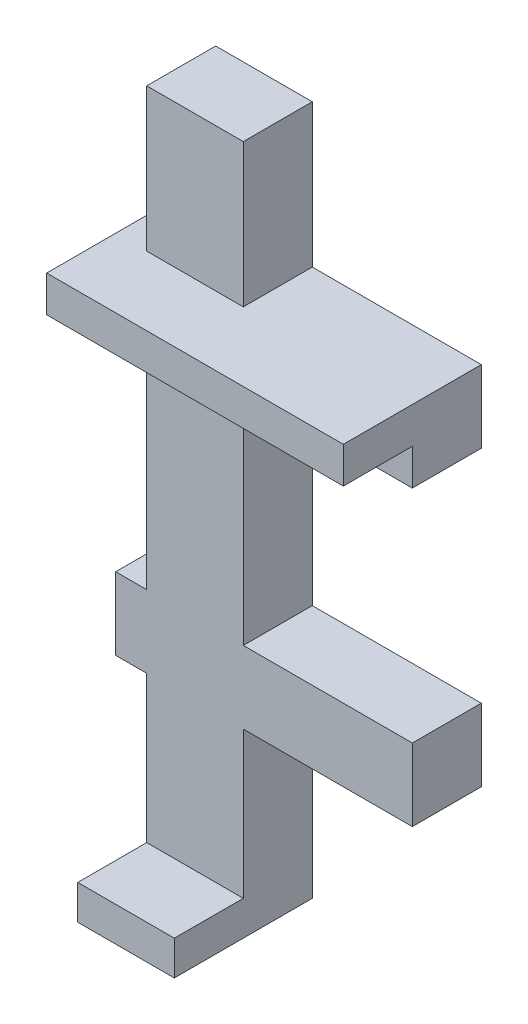
ISO-10303-21;
HEADER;
FILE_DESCRIPTION(('STEP AP214'),'2;1');
FILE_NAME('part.step','',(''),(''),'','','');
FILE_SCHEMA(('AUTOMOTIVE_DESIGN { 1 0 10303 214 1 1 1 1 }'));
ENDSEC;
DATA;
#1=APPLICATION_CONTEXT('core data for automotive mechanical design processes');
#2=APPLICATION_PROTOCOL_DEFINITION('international standard','automotive_design',2000,#1);
#3=PRODUCT_CONTEXT('',#1,'mechanical');
#4=PRODUCT('Part','Part','',(#3));
#5=PRODUCT_RELATED_PRODUCT_CATEGORY('part','',(#4));
#6=PRODUCT_DEFINITION_FORMATION('','',#4);
#7=PRODUCT_DEFINITION_CONTEXT('part definition',#1,'design');
#8=PRODUCT_DEFINITION('design','',#6,#7);
#9=PRODUCT_DEFINITION_SHAPE('','',#8);
#10=(LENGTH_UNIT() NAMED_UNIT(*) SI_UNIT(.MILLI.,.METRE.));
#11=(NAMED_UNIT(*) PLANE_ANGLE_UNIT() SI_UNIT($,.RADIAN.));
#12=(NAMED_UNIT(*) SI_UNIT($,.STERADIAN.) SOLID_ANGLE_UNIT());
#13=UNCERTAINTY_MEASURE_WITH_UNIT(LENGTH_MEASURE(1.E-05),#10,'distance_accuracy_value','');
#14=(GEOMETRIC_REPRESENTATION_CONTEXT(3) GLOBAL_UNCERTAINTY_ASSIGNED_CONTEXT((#13)) GLOBAL_UNIT_ASSIGNED_CONTEXT((#10,
#11,#12)) REPRESENTATION_CONTEXT('',''));
#15=CARTESIAN_POINT('',(0.,0.,0.));
#16=DIRECTION('',(0.,0.,1.));
#17=DIRECTION('',(1.,0.,0.));
#18=AXIS2_PLACEMENT_3D('',#15,#16,#17);
#19=CARTESIAN_POINT('',(0.,0.,4.));
#20=DIRECTION('',(0.,0.,1.));
#21=DIRECTION('',(1.,0.,0.));
#22=AXIS2_PLACEMENT_3D('',#19,#20,#21);
#23=PLANE('',#22);
#24=DIRECTION('',(0.,-1.,0.));
#25=VECTOR('',#24,1.);
#26=CARTESIAN_POINT('',(12.6,11.7,4.));
#27=LINE('',#26,#25);
#28=CARTESIAN_POINT('',(12.6,9.6,4.));
#29=VERTEX_POINT('',#28);
#30=CARTESIAN_POINT('',(12.6,7.5,4.));
#31=VERTEX_POINT('',#30);
#32=EDGE_CURVE('E244',#29,#31,#27,.T.);
#33=ORIENTED_EDGE('',*,*,#32,.F.);
#34=DIRECTION('',(1.,0.,0.));
#35=VECTOR('',#34,1.);
#36=CARTESIAN_POINT('',(-4.6,9.6,4.));
#37=LINE('',#36,#35);
#38=CARTESIAN_POINT('',(-4.6,9.6,4.));
#39=VERTEX_POINT('',#38);
#40=EDGE_CURVE('E483',#39,#29,#37,.T.);
#41=ORIENTED_EDGE('',*,*,#40,.F.);
#42=DIRECTION('',(0.,1.,0.));
#43=VECTOR('',#42,1.);
#44=CARTESIAN_POINT('',(-4.6,11.7,4.));
#45=LINE('',#44,#43);
#46=CARTESIAN_POINT('',(-4.6,7.5,4.));
#47=VERTEX_POINT('',#46);
#48=EDGE_CURVE('E232',#47,#39,#45,.T.);
#49=ORIENTED_EDGE('',*,*,#48,.F.);
#50=DIRECTION('',(1.,0.,0.));
#51=VECTOR('',#50,1.);
#52=CARTESIAN_POINT('',(-4.6,7.5,4.));
#53=LINE('',#52,#51);
#54=CARTESIAN_POINT('',(-2.8,7.5,4.));
#55=VERTEX_POINT('',#54);
#56=EDGE_CURVE('E370',#47,#55,#53,.T.);
#57=ORIENTED_EDGE('',*,*,#56,.T.);
#58=DIRECTION('',(0.,1.,0.));
#59=VECTOR('',#58,1.);
#60=CARTESIAN_POINT('',(-2.8,-20.,4.));
#61=LINE('',#60,#59);
#62=CARTESIAN_POINT('',(-2.8,-5.3,4.));
#63=VERTEX_POINT('',#62);
#64=EDGE_CURVE('E420',#63,#55,#61,.T.);
#65=ORIENTED_EDGE('',*,*,#64,.F.);
#66=DIRECTION('',(1.,0.,0.));
#67=VECTOR('',#66,1.);
#68=CARTESIAN_POINT('',(-4.6,-5.3,4.));
#69=LINE('',#68,#67);
#70=CARTESIAN_POINT('',(-4.6,-5.3,4.));
#71=VERTEX_POINT('',#70);
#72=EDGE_CURVE('E320',#71,#63,#69,.T.);
#73=ORIENTED_EDGE('',*,*,#72,.F.);
#74=DIRECTION('',(0.,-1.,0.));
#75=VECTOR('',#74,1.);
#76=CARTESIAN_POINT('',(-4.6,-9.5,4.));
#77=LINE('',#76,#75);
#78=CARTESIAN_POINT('',(-4.6,-9.5,4.));
#79=VERTEX_POINT('',#78);
#80=EDGE_CURVE('E302',#71,#79,#77,.T.);
#81=ORIENTED_EDGE('',*,*,#80,.T.);
#82=DIRECTION('',(1.,0.,0.));
#83=VECTOR('',#82,1.);
#84=CARTESIAN_POINT('',(-4.6,-9.5,4.));
#85=LINE('',#84,#83);
#86=CARTESIAN_POINT('',(-2.8,-9.5,4.));
#87=VERTEX_POINT('',#86);
#88=EDGE_CURVE('E323',#79,#87,#85,.T.);
#89=ORIENTED_EDGE('',*,*,#88,.T.);
#90=CARTESIAN_POINT('',(-2.8,-18.,4.));
#91=VERTEX_POINT('',#90);
#92=EDGE_CURVE('E415',#91,#87,#61,.T.);
#93=ORIENTED_EDGE('',*,*,#92,.F.);
#94=DIRECTION('',(-1.,0.,0.));
#95=VECTOR('',#94,1.);
#96=CARTESIAN_POINT('',(-2.8,-18.,4.));
#97=LINE('',#96,#95);
#98=CARTESIAN_POINT('',(2.8,-18.,4.));
#99=VERTEX_POINT('',#98);
#100=EDGE_CURVE('E378',#99,#91,#97,.T.);
#101=ORIENTED_EDGE('',*,*,#100,.F.);
#102=DIRECTION('',(0.,1.,0.));
#103=VECTOR('',#102,1.);
#104=CARTESIAN_POINT('',(2.8,-20.,4.));
#105=LINE('',#104,#103);
#106=CARTESIAN_POINT('',(2.8,-9.5,4.));
#107=VERTEX_POINT('',#106);
#108=EDGE_CURVE('E405',#99,#107,#105,.T.);
#109=ORIENTED_EDGE('',*,*,#108,.T.);
#110=DIRECTION('',(-1.,0.,0.));
#111=VECTOR('',#110,1.);
#112=CARTESIAN_POINT('',(4.6,-9.5,4.));
#113=LINE('',#112,#111);
#114=CARTESIAN_POINT('',(12.6,-9.5,4.));
#115=VERTEX_POINT('',#114);
#116=EDGE_CURVE('E280',#115,#107,#113,.T.);
#117=ORIENTED_EDGE('',*,*,#116,.F.);
#118=DIRECTION('',(0.,-1.,0.));
#119=VECTOR('',#118,1.);
#120=CARTESIAN_POINT('',(12.6,-5.3,4.));
#121=LINE('',#120,#119);
#122=CARTESIAN_POINT('',(12.6,-5.3,4.));
#123=VERTEX_POINT('',#122);
#124=EDGE_CURVE('E248',#123,#115,#121,.T.);
#125=ORIENTED_EDGE('',*,*,#124,.F.);
#126=DIRECTION('',(-1.,0.,0.));
#127=VECTOR('',#126,1.);
#128=CARTESIAN_POINT('',(4.6,-5.3,4.));
#129=LINE('',#128,#127);
#130=CARTESIAN_POINT('',(2.8,-5.3,4.));
#131=VERTEX_POINT('',#130);
#132=EDGE_CURVE('E284',#123,#131,#129,.T.);
#133=ORIENTED_EDGE('',*,*,#132,.T.);
#134=CARTESIAN_POINT('',(2.8,7.5,4.));
#135=VERTEX_POINT('',#134);
#136=EDGE_CURVE('E69',#131,#135,#105,.T.);
#137=ORIENTED_EDGE('',*,*,#136,.T.);
#138=DIRECTION('',(-1.,0.,0.));
#139=VECTOR('',#138,1.);
#140=CARTESIAN_POINT('',(4.6,7.5,4.));
#141=LINE('',#140,#139);
#142=EDGE_CURVE('E340',#31,#135,#141,.T.);
#143=ORIENTED_EDGE('',*,*,#142,.F.);
#144=EDGE_LOOP('',(#33,#41,#49,#57,#65,#73,#81,#89,#93,#101,#109,#117,#125,#133,#137,#143));
#145=FACE_BOUND('',#144,.T.);
#146=ADVANCED_FACE('F45',(#145),#23,.T.);
#147=CARTESIAN_POINT('',(-2.8,11.7,4.));
#148=VERTEX_POINT('',#147);
#149=CARTESIAN_POINT('',(-2.8,20.,4.));
#150=VERTEX_POINT('',#149);
#151=EDGE_CURVE('E414',#148,#150,#61,.T.);
#152=ORIENTED_EDGE('',*,*,#151,.F.);
#153=DIRECTION('',(-1.,0.,0.));
#154=VECTOR('',#153,1.);
#155=CARTESIAN_POINT('',(-4.6,11.7,4.));
#156=LINE('',#155,#154);
#157=CARTESIAN_POINT('',(2.8,11.7,4.));
#158=VERTEX_POINT('',#157);
#159=EDGE_CURVE('E226',#158,#148,#156,.T.);
#160=ORIENTED_EDGE('',*,*,#159,.F.);
#161=CARTESIAN_POINT('',(2.8,20.,4.));
#162=VERTEX_POINT('',#161);
#163=EDGE_CURVE('E410',#158,#162,#105,.T.);
#164=ORIENTED_EDGE('',*,*,#163,.T.);
#165=DIRECTION('',(1.,0.,0.));
#166=VECTOR('',#165,1.);
#167=CARTESIAN_POINT('',(-2.8,20.,4.));
#168=LINE('',#167,#166);
#169=EDGE_CURVE('E409',#150,#162,#168,.T.);
#170=ORIENTED_EDGE('',*,*,#169,.F.);
#171=EDGE_LOOP('',(#152,#160,#164,#170));
#172=FACE_BOUND('',#171,.T.);
#173=ADVANCED_FACE('F466',(#172),#23,.T.);
#174=CARTESIAN_POINT('',(2.8,-20.,4.));
#175=DIRECTION('',(-1.,0.,0.));
#176=DIRECTION('',(0.,0.,1.));
#177=AXIS2_PLACEMENT_3D('',#174,#175,#176);
#178=PLANE('',#177);
#179=DIRECTION('',(0.,0.,1.));
#180=VECTOR('',#179,1.);
#181=CARTESIAN_POINT('',(2.8,-5.3,0.));
#182=LINE('',#181,#180);
#183=CARTESIAN_POINT('',(2.8,-5.3,0.));
#184=VERTEX_POINT('',#183);
#185=EDGE_CURVE('E258',#184,#131,#182,.T.);
#186=ORIENTED_EDGE('',*,*,#185,.F.);
#187=DIRECTION('',(0.,1.,0.));
#188=VECTOR('',#187,1.);
#189=CARTESIAN_POINT('',(2.8,-20.,0.));
#190=LINE('',#189,#188);
#191=CARTESIAN_POINT('',(2.8,7.5,0.));
#192=VERTEX_POINT('',#191);
#193=EDGE_CURVE('E429',#184,#192,#190,.T.);
#194=ORIENTED_EDGE('',*,*,#193,.T.);
#195=DIRECTION('',(0.,0.,1.));
#196=VECTOR('',#195,1.);
#197=CARTESIAN_POINT('',(2.8,7.5,0.));
#198=LINE('',#197,#196);
#199=EDGE_CURVE('E333',#192,#135,#198,.T.);
#200=ORIENTED_EDGE('',*,*,#199,.T.);
#201=ORIENTED_EDGE('',*,*,#136,.F.);
#202=EDGE_LOOP('',(#186,#194,#200,#201));
#203=FACE_BOUND('',#202,.T.);
#204=ADVANCED_FACE('F478',(#203),#178,.F.);
#205=DIRECTION('',(0.,0.,-1.));
#206=VECTOR('',#205,1.);
#207=CARTESIAN_POINT('',(2.8,-9.5,0.));
#208=LINE('',#207,#206);
#209=CARTESIAN_POINT('',(2.8,-9.5,0.));
#210=VERTEX_POINT('',#209);
#211=EDGE_CURVE('E272',#107,#210,#208,.T.);
#212=ORIENTED_EDGE('',*,*,#211,.F.);
#213=ORIENTED_EDGE('',*,*,#108,.F.);
#214=DIRECTION('',(0.,0.,-1.));
#215=VECTOR('',#214,1.);
#216=CARTESIAN_POINT('',(2.8,-18.,8.));
#217=LINE('',#216,#215);
#218=CARTESIAN_POINT('',(2.8,-18.,8.));
#219=VERTEX_POINT('',#218);
#220=EDGE_CURVE('E400',#219,#99,#217,.T.);
#221=ORIENTED_EDGE('',*,*,#220,.F.);
#222=DIRECTION('',(0.,1.,0.));
#223=VECTOR('',#222,1.);
#224=CARTESIAN_POINT('',(2.8,-20.,8.));
#225=LINE('',#224,#223);
#226=CARTESIAN_POINT('',(2.8,-20.,8.));
#227=VERTEX_POINT('',#226);
#228=EDGE_CURVE('E387',#227,#219,#225,.T.);
#229=ORIENTED_EDGE('',*,*,#228,.F.);
#230=DIRECTION('',(0.,0.,-1.));
#231=VECTOR('',#230,1.);
#232=CARTESIAN_POINT('',(2.8,-20.,4.));
#233=LINE('',#232,#231);
#234=CARTESIAN_POINT('',(2.8,-20.,0.));
#235=VERTEX_POINT('',#234);
#236=EDGE_CURVE('E11',#227,#235,#233,.T.);
#237=ORIENTED_EDGE('',*,*,#236,.T.);
#238=EDGE_CURVE('E425',#235,#210,#190,.T.);
#239=ORIENTED_EDGE('',*,*,#238,.T.);
#240=EDGE_LOOP('',(#212,#213,#221,#229,#237,#239));
#241=FACE_BOUND('',#240,.T.);
#242=ADVANCED_FACE('F526',(#241),#178,.F.);
#243=CARTESIAN_POINT('',(-2.8,-20.,4.));
#244=DIRECTION('',(-1.,0.,0.));
#245=DIRECTION('',(0.,0.,1.));
#246=AXIS2_PLACEMENT_3D('',#243,#244,#245);
#247=PLANE('',#246);
#248=DIRECTION('',(0.,0.,-1.));
#249=VECTOR('',#248,1.);
#250=CARTESIAN_POINT('',(-2.8,-9.5,0.));
#251=LINE('',#250,#249);
#252=CARTESIAN_POINT('',(-2.8,-9.5,0.));
#253=VERTEX_POINT('',#252);
#254=EDGE_CURVE('E292',#87,#253,#251,.T.);
#255=ORIENTED_EDGE('',*,*,#254,.T.);
#256=DIRECTION('',(0.,1.,0.));
#257=VECTOR('',#256,1.);
#258=CARTESIAN_POINT('',(-2.8,-20.,0.));
#259=LINE('',#258,#257);
#260=CARTESIAN_POINT('',(-2.8,-20.,0.));
#261=VERTEX_POINT('',#260);
#262=EDGE_CURVE('E434',#261,#253,#259,.T.);
#263=ORIENTED_EDGE('',*,*,#262,.F.);
#264=DIRECTION('',(0.,0.,-1.));
#265=VECTOR('',#264,1.);
#266=CARTESIAN_POINT('',(-2.8,-20.,4.));
#267=LINE('',#266,#265);
#268=CARTESIAN_POINT('',(-2.8,-20.,8.));
#269=VERTEX_POINT('',#268);
#270=EDGE_CURVE('E419',#269,#261,#267,.T.);
#271=ORIENTED_EDGE('',*,*,#270,.F.);
#272=DIRECTION('',(0.,-1.,0.));
#273=VECTOR('',#272,1.);
#274=CARTESIAN_POINT('',(-2.8,-20.,8.));
#275=LINE('',#274,#273);
#276=CARTESIAN_POINT('',(-2.8,-18.,8.));
#277=VERTEX_POINT('',#276);
#278=EDGE_CURVE('E379',#277,#269,#275,.T.);
#279=ORIENTED_EDGE('',*,*,#278,.F.);
#280=DIRECTION('',(0.,0.,-1.));
#281=VECTOR('',#280,1.);
#282=CARTESIAN_POINT('',(-2.8,-18.,8.));
#283=LINE('',#282,#281);
#284=EDGE_CURVE('E393',#277,#91,#283,.T.);
#285=ORIENTED_EDGE('',*,*,#284,.T.);
#286=ORIENTED_EDGE('',*,*,#92,.T.);
#287=EDGE_LOOP('',(#255,#263,#271,#279,#285,#286));
#288=FACE_BOUND('',#287,.T.);
#289=ADVANCED_FACE('F517',(#288),#247,.T.);
#290=DIRECTION('',(0.,0.,-1.));
#291=VECTOR('',#290,1.);
#292=CARTESIAN_POINT('',(-2.8,11.7,0.));
#293=LINE('',#292,#291);
#294=CARTESIAN_POINT('',(-2.8,11.7,0.));
#295=VERTEX_POINT('',#294);
#296=EDGE_CURVE('E352',#148,#295,#293,.T.);
#297=ORIENTED_EDGE('',*,*,#296,.F.);
#298=ORIENTED_EDGE('',*,*,#151,.T.);
#299=DIRECTION('',(0.,0.,-1.));
#300=VECTOR('',#299,1.);
#301=CARTESIAN_POINT('',(-2.8,20.,4.));
#302=LINE('',#301,#300);
#303=CARTESIAN_POINT('',(-2.8,20.,0.));
#304=VERTEX_POINT('',#303);
#305=EDGE_CURVE('E441',#150,#304,#302,.T.);
#306=ORIENTED_EDGE('',*,*,#305,.T.);
#307=EDGE_CURVE('E433',#295,#304,#259,.T.);
#308=ORIENTED_EDGE('',*,*,#307,.F.);
#309=EDGE_LOOP('',(#297,#298,#306,#308));
#310=FACE_BOUND('',#309,.T.);
#311=ADVANCED_FACE('F463',(#310),#247,.T.);
#312=CARTESIAN_POINT('',(-2.8,-20.,4.));
#313=DIRECTION('',(0.,1.,0.));
#314=DIRECTION('',(0.,0.,1.));
#315=AXIS2_PLACEMENT_3D('',#312,#313,#314);
#316=PLANE('',#315);
#317=DIRECTION('',(1.,0.,0.));
#318=VECTOR('',#317,1.);
#319=CARTESIAN_POINT('',(-2.8,-20.,0.));
#320=LINE('',#319,#318);
#321=EDGE_CURVE('E404',#261,#235,#320,.T.);
#322=ORIENTED_EDGE('',*,*,#321,.T.);
#323=ORIENTED_EDGE('',*,*,#236,.F.);
#324=DIRECTION('',(1.,0.,0.));
#325=VECTOR('',#324,1.);
#326=CARTESIAN_POINT('',(-2.8,-20.,8.));
#327=LINE('',#326,#325);
#328=EDGE_CURVE('E383',#269,#227,#327,.T.);
#329=ORIENTED_EDGE('',*,*,#328,.F.);
#330=ORIENTED_EDGE('',*,*,#270,.T.);
#331=EDGE_LOOP('',(#322,#323,#329,#330));
#332=FACE_BOUND('',#331,.T.);
#333=ADVANCED_FACE('F47',(#332),#316,.F.);
#334=ORIENTED_EDGE('',*,*,#163,.F.);
#335=DIRECTION('',(0.,0.,-1.));
#336=VECTOR('',#335,1.);
#337=CARTESIAN_POINT('',(2.8,11.7,0.));
#338=LINE('',#337,#336);
#339=CARTESIAN_POINT('',(2.8,11.7,0.));
#340=VERTEX_POINT('',#339);
#341=EDGE_CURVE('E329',#158,#340,#338,.T.);
#342=ORIENTED_EDGE('',*,*,#341,.T.);
#343=CARTESIAN_POINT('',(2.8,20.,0.));
#344=VERTEX_POINT('',#343);
#345=EDGE_CURVE('E424',#340,#344,#190,.T.);
#346=ORIENTED_EDGE('',*,*,#345,.T.);
#347=DIRECTION('',(0.,0.,-1.));
#348=VECTOR('',#347,1.);
#349=CARTESIAN_POINT('',(2.8,20.,4.));
#350=LINE('',#349,#348);
#351=EDGE_CURVE('E54',#162,#344,#350,.T.);
#352=ORIENTED_EDGE('',*,*,#351,.F.);
#353=EDGE_LOOP('',(#334,#342,#346,#352));
#354=FACE_BOUND('',#353,.T.);
#355=ADVANCED_FACE('F560',(#354),#178,.F.);
#356=CARTESIAN_POINT('',(-2.8,20.,4.));
#357=DIRECTION('',(0.,1.,0.));
#358=DIRECTION('',(0.,0.,1.));
#359=AXIS2_PLACEMENT_3D('',#356,#357,#358);
#360=PLANE('',#359);
#361=DIRECTION('',(1.,0.,0.));
#362=VECTOR('',#361,1.);
#363=CARTESIAN_POINT('',(-2.8,20.,0.));
#364=LINE('',#363,#362);
#365=EDGE_CURVE('E428',#304,#344,#364,.T.);
#366=ORIENTED_EDGE('',*,*,#365,.F.);
#367=ORIENTED_EDGE('',*,*,#305,.F.);
#368=ORIENTED_EDGE('',*,*,#169,.T.);
#369=ORIENTED_EDGE('',*,*,#351,.T.);
#370=EDGE_LOOP('',(#366,#367,#368,#369));
#371=FACE_BOUND('',#370,.T.);
#372=ADVANCED_FACE('F449',(#371),#360,.T.);
#373=DIRECTION('',(0.,0.,1.));
#374=VECTOR('',#373,1.);
#375=CARTESIAN_POINT('',(-2.8,-5.3,0.));
#376=LINE('',#375,#374);
#377=CARTESIAN_POINT('',(-2.8,-5.3,0.));
#378=VERTEX_POINT('',#377);
#379=EDGE_CURVE('E298',#378,#63,#376,.T.);
#380=ORIENTED_EDGE('',*,*,#379,.T.);
#381=ORIENTED_EDGE('',*,*,#64,.T.);
#382=DIRECTION('',(0.,0.,1.));
#383=VECTOR('',#382,1.);
#384=CARTESIAN_POINT('',(-2.8,7.5,0.));
#385=LINE('',#384,#383);
#386=CARTESIAN_POINT('',(-2.8,7.5,0.));
#387=VERTEX_POINT('',#386);
#388=EDGE_CURVE('E347',#387,#55,#385,.T.);
#389=ORIENTED_EDGE('',*,*,#388,.F.);
#390=EDGE_CURVE('E438',#378,#387,#259,.T.);
#391=ORIENTED_EDGE('',*,*,#390,.F.);
#392=EDGE_LOOP('',(#380,#381,#389,#391));
#393=FACE_BOUND('',#392,.T.);
#394=ADVANCED_FACE('F504',(#393),#247,.T.);
#395=CARTESIAN_POINT('',(0.,0.,0.));
#396=DIRECTION('',(0.,0.,1.));
#397=DIRECTION('',(1.,0.,0.));
#398=AXIS2_PLACEMENT_3D('',#395,#396,#397);
#399=PLANE('',#398);
#400=ORIENTED_EDGE('',*,*,#321,.F.);
#401=ORIENTED_EDGE('',*,*,#262,.T.);
#402=DIRECTION('',(1.,0.,0.));
#403=VECTOR('',#402,1.);
#404=CARTESIAN_POINT('',(-4.6,-9.5,0.));
#405=LINE('',#404,#403);
#406=CARTESIAN_POINT('',(-4.6,-9.5,0.));
#407=VERTEX_POINT('',#406);
#408=EDGE_CURVE('E326',#407,#253,#405,.T.);
#409=ORIENTED_EDGE('',*,*,#408,.F.);
#410=DIRECTION('',(0.,1.,0.));
#411=VECTOR('',#410,1.);
#412=CARTESIAN_POINT('',(-4.6,-9.5,0.));
#413=LINE('',#412,#411);
#414=CARTESIAN_POINT('',(-4.6,-5.3,0.));
#415=VERTEX_POINT('',#414);
#416=EDGE_CURVE('E293',#407,#415,#413,.T.);
#417=ORIENTED_EDGE('',*,*,#416,.T.);
#418=DIRECTION('',(1.,0.,0.));
#419=VECTOR('',#418,1.);
#420=CARTESIAN_POINT('',(-4.6,-5.3,0.));
#421=LINE('',#420,#419);
#422=EDGE_CURVE('E310',#415,#378,#421,.T.);
#423=ORIENTED_EDGE('',*,*,#422,.T.);
#424=ORIENTED_EDGE('',*,*,#390,.T.);
#425=DIRECTION('',(1.,0.,0.));
#426=VECTOR('',#425,1.);
#427=CARTESIAN_POINT('',(-4.6,7.5,0.));
#428=LINE('',#427,#426);
#429=CARTESIAN_POINT('',(-4.6,7.5,0.));
#430=VERTEX_POINT('',#429);
#431=EDGE_CURVE('E374',#430,#387,#428,.T.);
#432=ORIENTED_EDGE('',*,*,#431,.F.);
#433=DIRECTION('',(0.,-1.,0.));
#434=VECTOR('',#433,1.);
#435=CARTESIAN_POINT('',(-4.6,11.7,0.));
#436=LINE('',#435,#434);
#437=CARTESIAN_POINT('',(-4.6,11.7,0.));
#438=VERTEX_POINT('',#437);
#439=EDGE_CURVE('E348',#438,#430,#436,.T.);
#440=ORIENTED_EDGE('',*,*,#439,.F.);
#441=DIRECTION('',(1.,0.,0.));
#442=VECTOR('',#441,1.);
#443=CARTESIAN_POINT('',(-4.6,11.7,0.));
#444=LINE('',#443,#442);
#445=EDGE_CURVE('E360',#438,#295,#444,.T.);
#446=ORIENTED_EDGE('',*,*,#445,.T.);
#447=ORIENTED_EDGE('',*,*,#307,.T.);
#448=ORIENTED_EDGE('',*,*,#365,.T.);
#449=ORIENTED_EDGE('',*,*,#345,.F.);
#450=DIRECTION('',(-1.,0.,0.));
#451=VECTOR('',#450,1.);
#452=CARTESIAN_POINT('',(4.6,11.7,0.));
#453=LINE('',#452,#451);
#454=CARTESIAN_POINT('',(12.6,11.7,0.));
#455=VERTEX_POINT('',#454);
#456=EDGE_CURVE('E344',#455,#340,#453,.T.);
#457=ORIENTED_EDGE('',*,*,#456,.F.);
#458=DIRECTION('',(0.,1.,0.));
#459=VECTOR('',#458,1.);
#460=CARTESIAN_POINT('',(12.6,11.7,0.));
#461=LINE('',#460,#459);
#462=CARTESIAN_POINT('',(12.6,7.5,0.));
#463=VERTEX_POINT('',#462);
#464=EDGE_CURVE('E252',#463,#455,#461,.T.);
#465=ORIENTED_EDGE('',*,*,#464,.F.);
#466=DIRECTION('',(-1.,0.,0.));
#467=VECTOR('',#466,1.);
#468=CARTESIAN_POINT('',(4.6,7.5,0.));
#469=LINE('',#468,#467);
#470=EDGE_CURVE('E336',#463,#192,#469,.T.);
#471=ORIENTED_EDGE('',*,*,#470,.T.);
#472=ORIENTED_EDGE('',*,*,#193,.F.);
#473=DIRECTION('',(-1.,0.,0.));
#474=VECTOR('',#473,1.);
#475=CARTESIAN_POINT('',(4.6,-5.3,0.));
#476=LINE('',#475,#474);
#477=CARTESIAN_POINT('',(12.6,-5.3,0.));
#478=VERTEX_POINT('',#477);
#479=EDGE_CURVE('E288',#478,#184,#476,.T.);
#480=ORIENTED_EDGE('',*,*,#479,.F.);
#481=DIRECTION('',(0.,1.,0.));
#482=VECTOR('',#481,1.);
#483=CARTESIAN_POINT('',(12.6,-5.3,0.));
#484=LINE('',#483,#482);
#485=CARTESIAN_POINT('',(12.6,-9.5,0.));
#486=VERTEX_POINT('',#485);
#487=EDGE_CURVE('E239',#486,#478,#484,.T.);
#488=ORIENTED_EDGE('',*,*,#487,.F.);
#489=DIRECTION('',(-1.,0.,0.));
#490=VECTOR('',#489,1.);
#491=CARTESIAN_POINT('',(4.6,-9.5,0.));
#492=LINE('',#491,#490);
#493=EDGE_CURVE('E276',#486,#210,#492,.T.);
#494=ORIENTED_EDGE('',*,*,#493,.T.);
#495=ORIENTED_EDGE('',*,*,#238,.F.);
#496=EDGE_LOOP('',(#400,#401,#409,#417,#423,#424,#432,#440,#446,#447,#448,#449,#457,#465,#471,
#472,#480,#488,#494,#495));
#497=FACE_BOUND('',#496,.T.);
#498=ADVANCED_FACE('F457',(#497),#399,.F.);
#499=CARTESIAN_POINT('',(-2.8,-18.,8.));
#500=DIRECTION('',(0.,-1.,0.));
#501=DIRECTION('',(0.,0.,-1.));
#502=AXIS2_PLACEMENT_3D('',#499,#500,#501);
#503=PLANE('',#502);
#504=ORIENTED_EDGE('',*,*,#100,.T.);
#505=ORIENTED_EDGE('',*,*,#284,.F.);
#506=DIRECTION('',(-1.,0.,0.));
#507=VECTOR('',#506,1.);
#508=CARTESIAN_POINT('',(-2.8,-18.,8.));
#509=LINE('',#508,#507);
#510=EDGE_CURVE('E390',#219,#277,#509,.T.);
#511=ORIENTED_EDGE('',*,*,#510,.F.);
#512=ORIENTED_EDGE('',*,*,#220,.T.);
#513=EDGE_LOOP('',(#504,#505,#511,#512));
#514=FACE_BOUND('',#513,.T.);
#515=ADVANCED_FACE('F522',(#514),#503,.F.);
#516=CARTESIAN_POINT('',(0.,0.,8.));
#517=DIRECTION('',(0.,0.,-1.));
#518=DIRECTION('',(-1.,0.,0.));
#519=AXIS2_PLACEMENT_3D('',#516,#517,#518);
#520=PLANE('',#519);
#521=ORIENTED_EDGE('',*,*,#278,.T.);
#522=ORIENTED_EDGE('',*,*,#328,.T.);
#523=ORIENTED_EDGE('',*,*,#228,.T.);
#524=ORIENTED_EDGE('',*,*,#510,.T.);
#525=EDGE_LOOP('',(#521,#522,#523,#524));
#526=FACE_BOUND('',#525,.T.);
#527=ADVANCED_FACE('F781',(#526),#520,.F.);
#528=CARTESIAN_POINT('',(-4.6,7.5,0.));
#529=DIRECTION('',(0.,1.,0.));
#530=DIRECTION('',(0.,0.,1.));
#531=AXIS2_PLACEMENT_3D('',#528,#529,#530);
#532=PLANE('',#531);
#533=ORIENTED_EDGE('',*,*,#388,.T.);
#534=ORIENTED_EDGE('',*,*,#56,.F.);
#535=DIRECTION('',(0.,0.,1.));
#536=VECTOR('',#535,1.);
#537=CARTESIAN_POINT('',(-4.6,7.5,0.));
#538=LINE('',#537,#536);
#539=EDGE_CURVE('E351',#430,#47,#538,.T.);
#540=ORIENTED_EDGE('',*,*,#539,.F.);
#541=ORIENTED_EDGE('',*,*,#431,.T.);
#542=EDGE_LOOP('',(#533,#534,#540,#541));
#543=FACE_BOUND('',#542,.T.);
#544=ADVANCED_FACE('F498',(#543),#532,.F.);
#545=CARTESIAN_POINT('',(-4.6,11.7,0.));
#546=DIRECTION('',(0.,-1.,0.));
#547=DIRECTION('',(0.,0.,-1.));
#548=AXIS2_PLACEMENT_3D('',#545,#546,#547);
#549=PLANE('',#548);
#550=ORIENTED_EDGE('',*,*,#296,.T.);
#551=ORIENTED_EDGE('',*,*,#445,.F.);
#552=DIRECTION('',(0.,0.,-1.));
#553=VECTOR('',#552,1.);
#554=CARTESIAN_POINT('',(-4.6,11.7,0.));
#555=LINE('',#554,#553);
#556=CARTESIAN_POINT('',(-4.6,11.7,8.));
#557=VERTEX_POINT('',#556);
#558=EDGE_CURVE('E357',#557,#438,#555,.T.);
#559=ORIENTED_EDGE('',*,*,#558,.F.);
#560=DIRECTION('',(-1.,0.,0.));
#561=VECTOR('',#560,1.);
#562=CARTESIAN_POINT('',(-4.6,11.7,8.));
#563=LINE('',#562,#561);
#564=CARTESIAN_POINT('',(12.6,11.7,8.));
#565=VERTEX_POINT('',#564);
#566=EDGE_CURVE('E223',#565,#557,#563,.T.);
#567=ORIENTED_EDGE('',*,*,#566,.F.);
#568=DIRECTION('',(0.,0.,1.));
#569=VECTOR('',#568,1.);
#570=CARTESIAN_POINT('',(12.6,11.7,4.));
#571=LINE('',#570,#569);
#572=EDGE_CURVE('E256',#455,#565,#571,.T.);
#573=ORIENTED_EDGE('',*,*,#572,.F.);
#574=ORIENTED_EDGE('',*,*,#456,.T.);
#575=ORIENTED_EDGE('',*,*,#341,.F.);
#576=ORIENTED_EDGE('',*,*,#159,.T.);
#577=EDGE_LOOP('',(#550,#551,#559,#567,#573,#574,#575,#576));
#578=FACE_BOUND('',#577,.T.);
#579=ADVANCED_FACE('F492',(#578),#549,.F.);
#580=CARTESIAN_POINT('',(-4.6,0.,0.));
#581=DIRECTION('',(-1.,0.,0.));
#582=DIRECTION('',(0.,0.,1.));
#583=AXIS2_PLACEMENT_3D('',#580,#581,#582);
#584=PLANE('',#583);
#585=ORIENTED_EDGE('',*,*,#439,.T.);
#586=ORIENTED_EDGE('',*,*,#539,.T.);
#587=ORIENTED_EDGE('',*,*,#48,.T.);
#588=DIRECTION('',(0.,0.,-1.));
#589=VECTOR('',#588,1.);
#590=CARTESIAN_POINT('',(-4.6,9.6,8.));
#591=LINE('',#590,#589);
#592=CARTESIAN_POINT('',(-4.6,9.6,8.));
#593=VERTEX_POINT('',#592);
#594=EDGE_CURVE('E211',#593,#39,#591,.T.);
#595=ORIENTED_EDGE('',*,*,#594,.F.);
#596=DIRECTION('',(0.,-1.,0.));
#597=VECTOR('',#596,1.);
#598=CARTESIAN_POINT('',(-4.6,11.7,8.));
#599=LINE('',#598,#597);
#600=EDGE_CURVE('E217',#557,#593,#599,.T.);
#601=ORIENTED_EDGE('',*,*,#600,.F.);
#602=ORIENTED_EDGE('',*,*,#558,.T.);
#603=EDGE_LOOP('',(#585,#586,#587,#595,#601,#602));
#604=FACE_BOUND('',#603,.T.);
#605=ADVANCED_FACE('F230',(#604),#584,.T.);
#606=CARTESIAN_POINT('',(4.6,7.5,0.));
#607=DIRECTION('',(0.,-1.,0.));
#608=DIRECTION('',(0.,0.,-1.));
#609=AXIS2_PLACEMENT_3D('',#606,#607,#608);
#610=PLANE('',#609);
#611=ORIENTED_EDGE('',*,*,#199,.F.);
#612=ORIENTED_EDGE('',*,*,#470,.F.);
#613=DIRECTION('',(0.,0.,-1.));
#614=VECTOR('',#613,1.);
#615=CARTESIAN_POINT('',(12.6,7.5,4.));
#616=LINE('',#615,#614);
#617=EDGE_CURVE('E247',#31,#463,#616,.T.);
#618=ORIENTED_EDGE('',*,*,#617,.F.);
#619=ORIENTED_EDGE('',*,*,#142,.T.);
#620=EDGE_LOOP('',(#611,#612,#618,#619));
#621=FACE_BOUND('',#620,.T.);
#622=ADVANCED_FACE('F477',(#621),#610,.T.);
#623=CARTESIAN_POINT('',(-4.6,-9.5,0.));
#624=DIRECTION('',(0.,-1.,0.));
#625=DIRECTION('',(0.,0.,-1.));
#626=AXIS2_PLACEMENT_3D('',#623,#624,#625);
#627=PLANE('',#626);
#628=ORIENTED_EDGE('',*,*,#254,.F.);
#629=ORIENTED_EDGE('',*,*,#88,.F.);
#630=DIRECTION('',(0.,0.,-1.));
#631=VECTOR('',#630,1.);
#632=CARTESIAN_POINT('',(-4.6,-9.5,0.));
#633=LINE('',#632,#631);
#634=EDGE_CURVE('E297',#79,#407,#633,.T.);
#635=ORIENTED_EDGE('',*,*,#634,.T.);
#636=ORIENTED_EDGE('',*,*,#408,.T.);
#637=EDGE_LOOP('',(#628,#629,#635,#636));
#638=FACE_BOUND('',#637,.T.);
#639=ADVANCED_FACE('F514',(#638),#627,.T.);
#640=CARTESIAN_POINT('',(-4.6,-5.3,0.));
#641=DIRECTION('',(0.,1.,0.));
#642=DIRECTION('',(0.,0.,1.));
#643=AXIS2_PLACEMENT_3D('',#640,#641,#642);
#644=PLANE('',#643);
#645=ORIENTED_EDGE('',*,*,#379,.F.);
#646=ORIENTED_EDGE('',*,*,#422,.F.);
#647=DIRECTION('',(0.,0.,1.));
#648=VECTOR('',#647,1.);
#649=CARTESIAN_POINT('',(-4.6,-5.3,0.));
#650=LINE('',#649,#648);
#651=EDGE_CURVE('E306',#415,#71,#650,.T.);
#652=ORIENTED_EDGE('',*,*,#651,.T.);
#653=ORIENTED_EDGE('',*,*,#72,.T.);
#654=EDGE_LOOP('',(#645,#646,#652,#653));
#655=FACE_BOUND('',#654,.T.);
#656=ADVANCED_FACE('F506',(#655),#644,.T.);
#657=CARTESIAN_POINT('',(-4.6,2.2,0.));
#658=DIRECTION('',(-1.,0.,0.));
#659=DIRECTION('',(0.,0.,1.));
#660=AXIS2_PLACEMENT_3D('',#657,#658,#659);
#661=PLANE('',#660);
#662=ORIENTED_EDGE('',*,*,#416,.F.);
#663=ORIENTED_EDGE('',*,*,#634,.F.);
#664=ORIENTED_EDGE('',*,*,#80,.F.);
#665=ORIENTED_EDGE('',*,*,#651,.F.);
#666=EDGE_LOOP('',(#662,#663,#664,#665));
#667=FACE_BOUND('',#666,.T.);
#668=ADVANCED_FACE('F511',(#667),#661,.T.);
#669=CARTESIAN_POINT('',(4.6,-5.3,0.));
#670=DIRECTION('',(0.,-1.,0.));
#671=DIRECTION('',(0.,0.,-1.));
#672=AXIS2_PLACEMENT_3D('',#669,#670,#671);
#673=PLANE('',#672);
#674=ORIENTED_EDGE('',*,*,#185,.T.);
#675=ORIENTED_EDGE('',*,*,#132,.F.);
#676=DIRECTION('',(0.,0.,1.));
#677=VECTOR('',#676,1.);
#678=CARTESIAN_POINT('',(12.6,-5.3,4.));
#679=LINE('',#678,#677);
#680=EDGE_CURVE('E234',#478,#123,#679,.T.);
#681=ORIENTED_EDGE('',*,*,#680,.F.);
#682=ORIENTED_EDGE('',*,*,#479,.T.);
#683=EDGE_LOOP('',(#674,#675,#681,#682));
#684=FACE_BOUND('',#683,.T.);
#685=ADVANCED_FACE('F536',(#684),#673,.F.);
#686=CARTESIAN_POINT('',(4.6,-9.5,0.));
#687=DIRECTION('',(0.,1.,0.));
#688=DIRECTION('',(0.,0.,1.));
#689=AXIS2_PLACEMENT_3D('',#686,#687,#688);
#690=PLANE('',#689);
#691=ORIENTED_EDGE('',*,*,#211,.T.);
#692=ORIENTED_EDGE('',*,*,#493,.F.);
#693=DIRECTION('',(0.,0.,-1.));
#694=VECTOR('',#693,1.);
#695=CARTESIAN_POINT('',(12.6,-9.5,4.));
#696=LINE('',#695,#694);
#697=EDGE_CURVE('E263',#115,#486,#696,.T.);
#698=ORIENTED_EDGE('',*,*,#697,.F.);
#699=ORIENTED_EDGE('',*,*,#116,.T.);
#700=EDGE_LOOP('',(#691,#692,#698,#699));
#701=FACE_BOUND('',#700,.T.);
#702=ADVANCED_FACE('F529',(#701),#690,.F.);
#703=CARTESIAN_POINT('',(12.6,0.,0.));
#704=DIRECTION('',(1.,0.,0.));
#705=DIRECTION('',(0.,0.,-1.));
#706=AXIS2_PLACEMENT_3D('',#703,#704,#705);
#707=PLANE('',#706);
#708=ORIENTED_EDGE('',*,*,#124,.T.);
#709=ORIENTED_EDGE('',*,*,#697,.T.);
#710=ORIENTED_EDGE('',*,*,#487,.T.);
#711=ORIENTED_EDGE('',*,*,#680,.T.);
#712=EDGE_LOOP('',(#708,#709,#710,#711));
#713=FACE_BOUND('',#712,.T.);
#714=ADVANCED_FACE('F534',(#713),#707,.T.);
#715=CARTESIAN_POINT('',(12.6,0.,0.));
#716=DIRECTION('',(1.,0.,0.));
#717=DIRECTION('',(0.,0.,-1.));
#718=AXIS2_PLACEMENT_3D('',#715,#716,#717);
#719=PLANE('',#718);
#720=ORIENTED_EDGE('',*,*,#572,.T.);
#721=DIRECTION('',(0.,1.,0.));
#722=VECTOR('',#721,1.);
#723=CARTESIAN_POINT('',(12.6,11.7,8.));
#724=LINE('',#723,#722);
#725=CARTESIAN_POINT('',(12.6,9.6,8.));
#726=VERTEX_POINT('',#725);
#727=EDGE_CURVE('E216',#726,#565,#724,.T.);
#728=ORIENTED_EDGE('',*,*,#727,.F.);
#729=DIRECTION('',(0.,0.,-1.));
#730=VECTOR('',#729,1.);
#731=CARTESIAN_POINT('',(12.6,9.6,8.));
#732=LINE('',#731,#730);
#733=EDGE_CURVE('E61',#726,#29,#732,.T.);
#734=ORIENTED_EDGE('',*,*,#733,.T.);
#735=ORIENTED_EDGE('',*,*,#32,.T.);
#736=ORIENTED_EDGE('',*,*,#617,.T.);
#737=ORIENTED_EDGE('',*,*,#464,.T.);
#738=EDGE_LOOP('',(#720,#728,#734,#735,#736,#737));
#739=FACE_BOUND('',#738,.T.);
#740=ADVANCED_FACE('F481',(#739),#719,.T.);
#741=CARTESIAN_POINT('',(-4.6,9.6,8.));
#742=DIRECTION('',(0.,1.,0.));
#743=DIRECTION('',(0.,0.,1.));
#744=AXIS2_PLACEMENT_3D('',#741,#742,#743);
#745=PLANE('',#744);
#746=ORIENTED_EDGE('',*,*,#40,.T.);
#747=ORIENTED_EDGE('',*,*,#733,.F.);
#748=DIRECTION('',(1.,0.,0.));
#749=VECTOR('',#748,1.);
#750=CARTESIAN_POINT('',(-4.6,9.6,8.));
#751=LINE('',#750,#749);
#752=EDGE_CURVE('E207',#593,#726,#751,.T.);
#753=ORIENTED_EDGE('',*,*,#752,.F.);
#754=ORIENTED_EDGE('',*,*,#594,.T.);
#755=EDGE_LOOP('',(#746,#747,#753,#754));
#756=FACE_BOUND('',#755,.T.);
#757=ADVANCED_FACE('F209',(#756),#745,.F.);
#758=CARTESIAN_POINT('',(0.,0.,8.));
#759=DIRECTION('',(0.,0.,1.));
#760=DIRECTION('',(1.,0.,0.));
#761=AXIS2_PLACEMENT_3D('',#758,#759,#760);
#762=PLANE('',#761);
#763=ORIENTED_EDGE('',*,*,#600,.T.);
#764=ORIENTED_EDGE('',*,*,#752,.T.);
#765=ORIENTED_EDGE('',*,*,#727,.T.);
#766=ORIENTED_EDGE('',*,*,#566,.T.);
#767=EDGE_LOOP('',(#763,#764,#765,#766));
#768=FACE_BOUND('',#767,.T.);
#769=ADVANCED_FACE('F221',(#768),#762,.T.);
#770=CLOSED_SHELL('',(#146,#173,#204,#242,#289,#311,#333,#355,#372,#394,#498,#515,#527,#544,
#579,#605,#622,#639,#656,#668,#685,#702,#714,#740,#757,#769));
#771=MANIFOLD_SOLID_BREP('B2',#770);
#772=ADVANCED_BREP_SHAPE_REPRESENTATION('',(#18,#771),#14);
#773=SHAPE_DEFINITION_REPRESENTATION(#9,#772);
ENDSEC;
END-ISO-10303-21;
